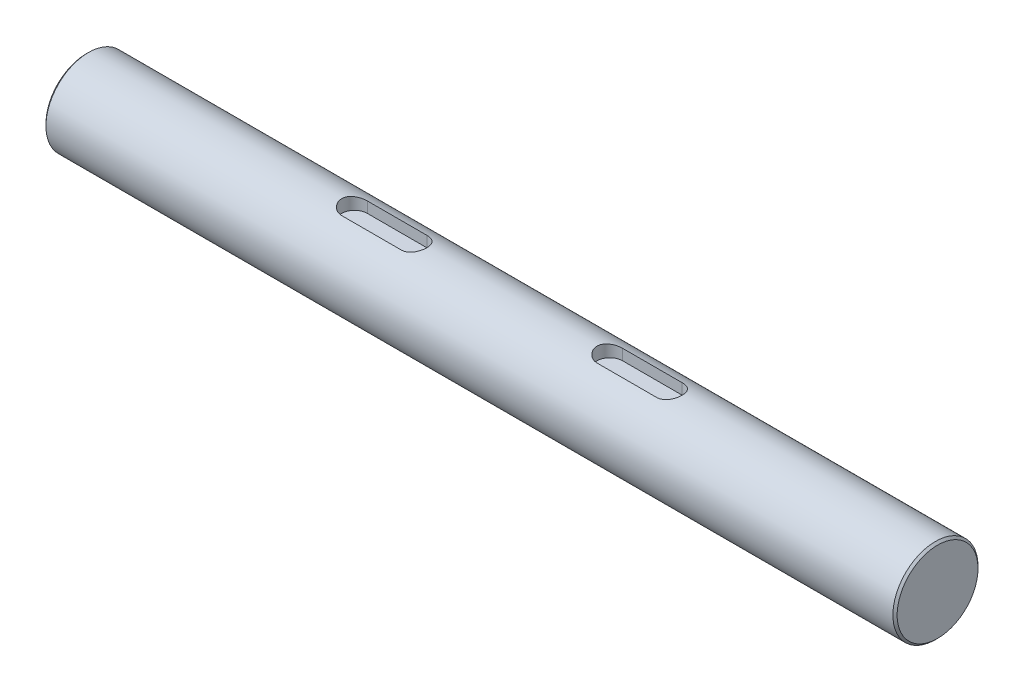
ISO-10303-21;
HEADER;
FILE_DESCRIPTION(('STEP AP214'),'2;1');
FILE_NAME('part.step','',(''),(''),'','','');
FILE_SCHEMA(('AUTOMOTIVE_DESIGN { 1 0 10303 214 1 1 1 1 }'));
ENDSEC;
DATA;
#1=APPLICATION_CONTEXT('core data for automotive mechanical design processes');
#2=APPLICATION_PROTOCOL_DEFINITION('international standard','automotive_design',2000,#1);
#3=PRODUCT_CONTEXT('',#1,'mechanical');
#4=PRODUCT('Part','Part','',(#3));
#5=PRODUCT_RELATED_PRODUCT_CATEGORY('part','',(#4));
#6=PRODUCT_DEFINITION_FORMATION('','',#4);
#7=PRODUCT_DEFINITION_CONTEXT('part definition',#1,'design');
#8=PRODUCT_DEFINITION('design','',#6,#7);
#9=PRODUCT_DEFINITION_SHAPE('','',#8);
#10=(LENGTH_UNIT() NAMED_UNIT(*) SI_UNIT(.MILLI.,.METRE.));
#11=(NAMED_UNIT(*) PLANE_ANGLE_UNIT() SI_UNIT($,.RADIAN.));
#12=(NAMED_UNIT(*) SI_UNIT($,.STERADIAN.) SOLID_ANGLE_UNIT());
#13=UNCERTAINTY_MEASURE_WITH_UNIT(LENGTH_MEASURE(1.E-05),#10,'distance_accuracy_value','');
#14=(GEOMETRIC_REPRESENTATION_CONTEXT(3) GLOBAL_UNCERTAINTY_ASSIGNED_CONTEXT((#13)) GLOBAL_UNIT_ASSIGNED_CONTEXT((#10,
#11,#12)) REPRESENTATION_CONTEXT('',''));
#15=CARTESIAN_POINT('',(0.,0.,0.));
#16=DIRECTION('',(0.,0.,1.));
#17=DIRECTION('',(1.,0.,0.));
#18=AXIS2_PLACEMENT_3D('',#15,#16,#17);
#19=CARTESIAN_POINT('',(100.,0.,0.));
#20=DIRECTION('',(-1.,0.,0.));
#21=DIRECTION('',(0.,0.,1.));
#22=AXIS2_PLACEMENT_3D('',#19,#20,#21);
#23=CYLINDRICAL_SURFACE('',#22,10.);
#24=CARTESIAN_POINT('',(199.5,0.,0.));
#25=DIRECTION('',(1.,0.,0.));
#26=DIRECTION('',(0.,0.,-1.));
#27=AXIS2_PLACEMENT_3D('',#24,#25,#26);
#28=CIRCLE('',#27,10.);
#29=CARTESIAN_POINT('',(199.5,0.,-10.));
#30=VERTEX_POINT('',#29);
#31=EDGE_CURVE('E11',#30,#30,#28,.F.);
#32=ORIENTED_EDGE('',*,*,#31,.T.);
#33=EDGE_LOOP('',(#32));
#34=FACE_BOUND('',#33,.T.);
#35=DIRECTION('',(-1.,0.,0.));
#36=VECTOR('',#35,1.);
#37=CARTESIAN_POINT('',(100.,9.53939201416946,-3.));
#38=LINE('',#37,#36);
#39=CARTESIAN_POINT('',(123.,9.53939201416946,-3.));
#40=VERTEX_POINT('',#39);
#41=CARTESIAN_POINT('',(137.,9.53939201416946,-3.));
#42=VERTEX_POINT('',#41);
#43=EDGE_CURVE('E385',#40,#42,#38,.F.);
#44=ORIENTED_EDGE('',*,*,#43,.T.);
#45=CARTESIAN_POINT('',(137.,9.53939201416946,-3.));
#46=CARTESIAN_POINT('',(137.082335520823,9.53938054248206,-3.00001027845728));
#47=CARTESIAN_POINT('',(137.164664455063,9.54045772064378,-2.99661062684472));
#48=CARTESIAN_POINT('',(137.328693952765,9.54470412105986,-2.98307142899347));
#49=CARTESIAN_POINT('',(137.410394653324,9.54787287296849,-2.97293339805419));
#50=CARTESIAN_POINT('',(137.572384915673,9.55620668351003,-2.94603140625046));
#51=CARTESIAN_POINT('',(137.652677524043,9.56136667250114,-2.92928426957738));
#52=CARTESIAN_POINT('',(137.811475844134,9.57351626651178,-2.88932853030395));
#53=CARTESIAN_POINT('',(137.889981509067,9.58050591937828,-2.86611975872641));
#54=CARTESIAN_POINT('',(138.12194938799,9.60391637654137,-2.78708584446024));
#55=CARTESIAN_POINT('',(138.272068438833,9.62279007830391,-2.72181852542972));
#56=CARTESIAN_POINT('',(138.559226043979,9.66493213967819,-2.56815043531276));
#57=CARTESIAN_POINT('',(138.696258470762,9.68820254290641,-2.4797388992416));
#58=CARTESIAN_POINT('',(138.957722987948,9.73733650515374,-2.27929879634443));
#59=CARTESIAN_POINT('',(139.081684874061,9.76325505469874,-2.16666914746584));
#60=CARTESIAN_POINT('',(139.309273614839,9.81429628475077,-1.92227736150434));
#61=CARTESIAN_POINT('',(139.412897033861,9.8394188301941,-1.79051199848164));
#62=CARTESIAN_POINT('',(139.598926865095,9.88666477976534,-1.50821997465698));
#63=CARTESIAN_POINT('',(139.680850179783,9.90871541546877,-1.35736167401016));
#64=CARTESIAN_POINT('',(139.817977004003,9.94668940088144,-1.04324233568303));
#65=CARTESIAN_POINT('',(139.873187403368,9.96261433032403,-0.879984508687989));
#66=CARTESIAN_POINT('',(139.953759551791,9.98615279768398,-0.550649404820608));
#67=CARTESIAN_POINT('',(139.979929703518,9.99399098526792,-0.384786253016209));
#68=CARTESIAN_POINT('',(140.004234695146,10.0012640407204,-0.0508471415689363));
#69=CARTESIAN_POINT('',(140.002374842678,10.0007004995012,0.117228393125328));
#70=CARTESIAN_POINT('',(139.971214179309,9.99139205125586,0.445143199271813));
#71=CARTESIAN_POINT('',(139.942789309192,9.98290831016512,0.605074290763019));
#72=CARTESIAN_POINT('',(139.860736730375,9.95903027401823,0.917780104370304));
#73=CARTESIAN_POINT('',(139.807107701317,9.94363561692558,1.07055445110878));
#74=CARTESIAN_POINT('',(139.675575556475,9.90730429851782,1.3666956317391));
#75=CARTESIAN_POINT('',(139.597396711224,9.88630511384915,1.50993201207611));
#76=CARTESIAN_POINT('',(139.419202819966,9.84099249303647,1.78153105916099));
#77=CARTESIAN_POINT('',(139.319182881059,9.81667831471806,1.90989038323249));
#78=CARTESIAN_POINT('',(139.095616023815,9.7662334714278,2.15330901082204));
#79=CARTESIAN_POINT('',(138.971312272474,9.74006890899097,2.26766702955975));
#80=CARTESIAN_POINT('',(138.705005153149,9.68968430229327,2.47413538985067));
#81=CARTESIAN_POINT('',(138.56299663927,9.66546482675134,2.5662392402618));
#82=CARTESIAN_POINT('',(138.2634381431,9.62154457591303,2.72632814481701));
#83=CARTESIAN_POINT('',(138.105745640813,9.60189192491895,2.79406012682262));
#84=CARTESIAN_POINT('',(137.780550992037,9.56991327306402,2.90171772009404));
#85=CARTESIAN_POINT('',(137.613064278571,9.55757606951749,2.94168586436072));
#86=CARTESIAN_POINT('',(137.37001022186,9.54628064650012,2.97802407180158));
#87=CARTESIAN_POINT('',(137.296218531641,9.54370312550533,2.98626405978017));
#88=CARTESIAN_POINT('',(137.148297041801,9.54025857223564,2.99724711229708));
#89=CARTESIAN_POINT('',(137.074167900672,9.53938902493288,2.99999825936538));
#90=CARTESIAN_POINT('',(137.,9.53939201416946,3.));
#91=B_SPLINE_CURVE_WITH_KNOTS('',3,(#45,#46,#47,#48,#49,#50,#51,#52,#53,#54,#55,#56,#57,#58,#59,
#60,#61,#62,#63,#64,#65,#66,#67,#68,#69,#70,#71,#72,#73,#74,#75,#76,#77,#78,#79,#80,#81,#82,#83,
#84,#85,#86,#87,#88,#89,#90),.UNSPECIFIED.,.F.,.F.,(4,2,2,2,2,2,2,2,2,2,2,2,2,2,2,2,2,2,2,2,2,2,
4),(0.,0.246918142439474,0.493780777706052,0.740019009622984,0.986263681482012,1.47813347402026,
1.97023245590778,2.47635119822767,2.98255536239032,3.4992281062007,4.01576751791672,
4.51753600864763,5.019209488041,5.50490358251092,5.9906231236083,6.4820058335062,
6.97349873739168,7.48389234847122,7.99443465298716,8.51013494368213,9.02504345105573,
9.24774267716778,9.47011372732391),.UNSPECIFIED.);
#92=CARTESIAN_POINT('',(137.,9.53939201416946,3.));
#93=VERTEX_POINT('',#92);
#94=EDGE_CURVE('E205',#42,#93,#91,.T.);
#95=ORIENTED_EDGE('',*,*,#94,.T.);
#96=DIRECTION('',(-1.,0.,0.));
#97=VECTOR('',#96,1.);
#98=CARTESIAN_POINT('',(100.,9.53939201416946,3.));
#99=LINE('',#98,#97);
#100=CARTESIAN_POINT('',(123.,9.53939201416946,3.));
#101=VERTEX_POINT('',#100);
#102=EDGE_CURVE('E387',#93,#101,#99,.T.);
#103=ORIENTED_EDGE('',*,*,#102,.T.);
#104=CARTESIAN_POINT('',(123.,9.53939201416946,3.));
#105=CARTESIAN_POINT('',(122.917664479177,9.53938054248207,3.00001027845728));
#106=CARTESIAN_POINT('',(122.835335544937,9.54045772064378,2.99661062684472));
#107=CARTESIAN_POINT('',(122.671306047235,9.54470412105986,2.98307142899347));
#108=CARTESIAN_POINT('',(122.589605346676,9.54787287296849,2.97293339805418));
#109=CARTESIAN_POINT('',(122.427615084327,9.55620668351003,2.94603140625045));
#110=CARTESIAN_POINT('',(122.347322475957,9.56136667250114,2.92928426957737));
#111=CARTESIAN_POINT('',(122.188524155866,9.57351626651178,2.88932853030394));
#112=CARTESIAN_POINT('',(122.110018490933,9.58050591937828,2.8661197587264));
#113=CARTESIAN_POINT('',(121.87805061201,9.60391637654137,2.78708584446024));
#114=CARTESIAN_POINT('',(121.727931561167,9.62279007830391,2.72181852542972));
#115=CARTESIAN_POINT('',(121.440773956021,9.66493213967819,2.56815043531276));
#116=CARTESIAN_POINT('',(121.303741529238,9.68820254290641,2.4797388992416));
#117=CARTESIAN_POINT('',(121.042277012052,9.73733650515374,2.27929879634443));
#118=CARTESIAN_POINT('',(120.918315125939,9.76325505469874,2.16666914746584));
#119=CARTESIAN_POINT('',(120.690726385161,9.81429628475077,1.92227736150433));
#120=CARTESIAN_POINT('',(120.587102966139,9.8394188301941,1.79051199848164));
#121=CARTESIAN_POINT('',(120.401073134905,9.88666477976534,1.50821997465697));
#122=CARTESIAN_POINT('',(120.319149820217,9.90871541546878,1.35736167401015));
#123=CARTESIAN_POINT('',(120.182022995997,9.94668940088144,1.04324233568302));
#124=CARTESIAN_POINT('',(120.126812596632,9.96261433032403,0.879984508687983));
#125=CARTESIAN_POINT('',(120.046240448209,9.98615279768398,0.550649404820599));
#126=CARTESIAN_POINT('',(120.020070296482,9.99399098526792,0.384786253016201));
#127=CARTESIAN_POINT('',(119.995765304854,10.0012640407204,0.0508471415689247));
#128=CARTESIAN_POINT('',(119.997625157322,10.0007004995012,-0.117228393125343));
#129=CARTESIAN_POINT('',(120.028785820691,9.99139205125586,-0.445143199271829));
#130=CARTESIAN_POINT('',(120.057210690808,9.98290831016512,-0.605074290763033));
#131=CARTESIAN_POINT('',(120.139263269626,9.95903027401822,-0.917780104370318));
#132=CARTESIAN_POINT('',(120.192892298683,9.94363561692558,-1.07055445110879));
#133=CARTESIAN_POINT('',(120.324424443525,9.90730429851782,-1.36669563173912));
#134=CARTESIAN_POINT('',(120.402603288776,9.88630511384915,-1.50993201207613));
#135=CARTESIAN_POINT('',(120.580797180034,9.84099249303646,-1.78153105916101));
#136=CARTESIAN_POINT('',(120.680817118941,9.81667831471806,-1.90989038323251));
#137=CARTESIAN_POINT('',(120.904383976185,9.7662334714278,-2.15330901082205));
#138=CARTESIAN_POINT('',(121.028687727526,9.74006890899097,-2.26766702955975));
#139=CARTESIAN_POINT('',(121.294994846851,9.68968430229327,-2.47413538985067));
#140=CARTESIAN_POINT('',(121.43700336073,9.66546482675134,-2.5662392402618));
#141=CARTESIAN_POINT('',(121.7365618569,9.62154457591303,-2.72632814481701));
#142=CARTESIAN_POINT('',(121.894254359187,9.60189192491895,-2.79406012682263));
#143=CARTESIAN_POINT('',(122.219449007963,9.56991327306402,-2.90171772009405));
#144=CARTESIAN_POINT('',(122.386935721429,9.55757606951749,-2.94168586436072));
#145=CARTESIAN_POINT('',(122.62998977814,9.54628064650012,-2.97802407180159));
#146=CARTESIAN_POINT('',(122.703781468359,9.54370312550533,-2.98626405978017));
#147=CARTESIAN_POINT('',(122.851702958199,9.54025857223564,-2.99724711229708));
#148=CARTESIAN_POINT('',(122.925832099328,9.53938902493288,-2.99999825936538));
#149=CARTESIAN_POINT('',(123.,9.53939201416946,-3.));
#150=B_SPLINE_CURVE_WITH_KNOTS('',3,(#104,#105,#106,#107,#108,#109,#110,#111,#112,#113,#114,
#115,#116,#117,#118,#119,#120,#121,#122,#123,#124,#125,#126,#127,#128,#129,#130,#131,#132,#133,
#134,#135,#136,#137,#138,#139,#140,#141,#142,#143,#144,#145,#146,#147,#148,#149),.UNSPECIFIED.,
.F.,.F.,(4,2,2,2,2,2,2,2,2,2,2,2,2,2,2,2,2,2,2,2,2,2,4),(0.,0.246918142439488,0.493780777706108,
0.740019009623027,0.986263681482027,1.47813347402025,1.97023245590778,2.47635119822765,
2.98255536239033,3.49922810620071,4.01576751791672,4.51753600864764,5.01920948804101,
5.50490358251093,5.99062312360832,6.48200583350622,6.9734987373917,7.48389234847122,
7.99443465298715,8.51013494368214,9.02504345105574,9.24774267716778,9.47011372732391),.UNSPECIFIED.);
#151=EDGE_CURVE('E58',#101,#40,#150,.T.);
#152=ORIENTED_EDGE('',*,*,#151,.T.);
#153=EDGE_LOOP('',(#44,#95,#103,#152));
#154=FACE_BOUND('',#153,.T.);
#155=CARTESIAN_POINT('',(0.499999999999987,0.,0.));
#156=DIRECTION('',(1.,0.,0.));
#157=DIRECTION('',(0.,0.,-1.));
#158=AXIS2_PLACEMENT_3D('',#155,#156,#157);
#159=CIRCLE('',#158,10.);
#160=CARTESIAN_POINT('',(0.499999999999987,0.,-10.));
#161=VERTEX_POINT('',#160);
#162=EDGE_CURVE('E206',#161,#161,#159,.T.);
#163=ORIENTED_EDGE('',*,*,#162,.T.);
#164=EDGE_LOOP('',(#163));
#165=FACE_BOUND('',#164,.T.);
#166=DIRECTION('',(-1.,0.,0.));
#167=VECTOR('',#166,1.);
#168=CARTESIAN_POINT('',(100.,9.53939201416946,-3.));
#169=LINE('',#168,#167);
#170=CARTESIAN_POINT('',(63.,9.53939201416946,-3.));
#171=VERTEX_POINT('',#170);
#172=CARTESIAN_POINT('',(77.,9.53939201416946,-3.));
#173=VERTEX_POINT('',#172);
#174=EDGE_CURVE('E211',#171,#173,#169,.F.);
#175=ORIENTED_EDGE('',*,*,#174,.T.);
#176=CARTESIAN_POINT('',(77.,9.53939201416946,-3.));
#177=CARTESIAN_POINT('',(77.0823355208227,9.53938054248207,-3.00001027845728));
#178=CARTESIAN_POINT('',(77.1646644550632,9.54045772064378,-2.99661062684472));
#179=CARTESIAN_POINT('',(77.3286939527655,9.54470412105986,-2.98307142899347));
#180=CARTESIAN_POINT('',(77.4103946533244,9.54787287296849,-2.97293339805418));
#181=CARTESIAN_POINT('',(77.5723849156732,9.55620668351003,-2.94603140625045));
#182=CARTESIAN_POINT('',(77.652677524043,9.56136667250114,-2.92928426957737));
#183=CARTESIAN_POINT('',(77.8114758441342,9.57351626651178,-2.88932853030394));
#184=CARTESIAN_POINT('',(77.8899815090674,9.58050591937828,-2.8661197587264));
#185=CARTESIAN_POINT('',(78.1219493879902,9.60391637654137,-2.78708584446024));
#186=CARTESIAN_POINT('',(78.272068438833,9.62279007830391,-2.72181852542972));
#187=CARTESIAN_POINT('',(78.559226043979,9.66493213967819,-2.56815043531276));
#188=CARTESIAN_POINT('',(78.6962584707622,9.68820254290641,-2.4797388992416));
#189=CARTESIAN_POINT('',(78.9577229879478,9.73733650515374,-2.27929879634443));
#190=CARTESIAN_POINT('',(79.0816848740609,9.76325505469874,-2.16666914746584));
#191=CARTESIAN_POINT('',(79.3092736148387,9.81429628475077,-1.92227736150433));
#192=CARTESIAN_POINT('',(79.412897033861,9.8394188301941,-1.79051199848164));
#193=CARTESIAN_POINT('',(79.5989268650946,9.88666477976534,-1.50821997465697));
#194=CARTESIAN_POINT('',(79.6808501797826,9.90871541546877,-1.35736167401016));
#195=CARTESIAN_POINT('',(79.8179770040029,9.94668940088144,-1.04324233568303));
#196=CARTESIAN_POINT('',(79.873187403368,9.96261433032403,-0.879984508687985));
#197=CARTESIAN_POINT('',(79.953759551791,9.98615279768398,-0.550649404820601));
#198=CARTESIAN_POINT('',(79.9799297035176,9.99399098526792,-0.384786253016201));
#199=CARTESIAN_POINT('',(80.004234695146,10.0012640407204,-0.0508471415689243));
#200=CARTESIAN_POINT('',(80.0023748426782,10.0007004995012,0.117228393125343));
#201=CARTESIAN_POINT('',(79.9712141793085,9.99139205125586,0.445143199271829));
#202=CARTESIAN_POINT('',(79.9427893091919,9.98290831016512,0.605074290763033));
#203=CARTESIAN_POINT('',(79.8607367303745,9.95903027401822,0.917780104370318));
#204=CARTESIAN_POINT('',(79.8071077013173,9.94363561692558,1.07055445110879));
#205=CARTESIAN_POINT('',(79.6755755564753,9.90730429851782,1.36669563173912));
#206=CARTESIAN_POINT('',(79.5973967112239,9.88630511384915,1.50993201207613));
#207=CARTESIAN_POINT('',(79.4192028199656,9.84099249303646,1.78153105916101));
#208=CARTESIAN_POINT('',(79.3191828810593,9.81667831471806,1.90989038323251));
#209=CARTESIAN_POINT('',(79.0956160238154,9.7662334714278,2.15330901082205));
#210=CARTESIAN_POINT('',(78.9713122724738,9.74006890899097,2.26766702955975));
#211=CARTESIAN_POINT('',(78.7050051531489,9.68968430229327,2.47413538985067));
#212=CARTESIAN_POINT('',(78.5629966392702,9.66546482675134,2.5662392402618));
#213=CARTESIAN_POINT('',(78.2634381431001,9.62154457591303,2.72632814481701));
#214=CARTESIAN_POINT('',(78.1057456408129,9.60189192491895,2.79406012682263));
#215=CARTESIAN_POINT('',(77.7805509920369,9.56991327306402,2.90171772009405));
#216=CARTESIAN_POINT('',(77.6130642785713,9.55757606951749,2.94168586436072));
#217=CARTESIAN_POINT('',(77.3700102218596,9.54628064650012,2.97802407180159));
#218=CARTESIAN_POINT('',(77.2962185316408,9.54370312550533,2.98626405978017));
#219=CARTESIAN_POINT('',(77.148297041801,9.54025857223564,2.99724711229708));
#220=CARTESIAN_POINT('',(77.0741679006723,9.53938902493288,2.99999825936538));
#221=CARTESIAN_POINT('',(77.,9.53939201416946,3.));
#222=B_SPLINE_CURVE_WITH_KNOTS('',3,(#176,#177,#178,#179,#180,#181,#182,#183,#184,#185,#186,
#187,#188,#189,#190,#191,#192,#193,#194,#195,#196,#197,#198,#199,#200,#201,#202,#203,#204,#205,
#206,#207,#208,#209,#210,#211,#212,#213,#214,#215,#216,#217,#218,#219,#220,#221),.UNSPECIFIED.,
.F.,.F.,(4,2,2,2,2,2,2,2,2,2,2,2,2,2,2,2,2,2,2,2,2,2,4),(0.,0.246918142439488,0.493780777706108,
0.740019009623027,0.986263681482027,1.47813347402025,1.97023245590778,2.47635119822765,
2.98255536239033,3.4992281062007,4.01576751791672,4.51753600864764,5.01920948804101,
5.50490358251093,5.99062312360832,6.48200583350621,6.9734987373917,7.48389234847122,
7.99443465298715,8.51013494368214,9.02504345105574,9.24774267716777,9.47011372732391),.UNSPECIFIED.);
#223=CARTESIAN_POINT('',(77.,9.53939201416946,3.));
#224=VERTEX_POINT('',#223);
#225=EDGE_CURVE('E155',#173,#224,#222,.T.);
#226=ORIENTED_EDGE('',*,*,#225,.T.);
#227=DIRECTION('',(-1.,0.,0.));
#228=VECTOR('',#227,1.);
#229=CARTESIAN_POINT('',(100.,9.53939201416946,3.));
#230=LINE('',#229,#228);
#231=CARTESIAN_POINT('',(63.,9.53939201416946,3.));
#232=VERTEX_POINT('',#231);
#233=EDGE_CURVE('E252',#224,#232,#230,.T.);
#234=ORIENTED_EDGE('',*,*,#233,.T.);
#235=CARTESIAN_POINT('',(63.,9.53939201416946,3.));
#236=CARTESIAN_POINT('',(62.9176644791773,9.53938054248207,3.00001027845728));
#237=CARTESIAN_POINT('',(62.8353355449368,9.54045772064378,2.99661062684472));
#238=CARTESIAN_POINT('',(62.6713060472345,9.54470412105986,2.98307142899347));
#239=CARTESIAN_POINT('',(62.5896053466756,9.54787287296848,2.97293339805418));
#240=CARTESIAN_POINT('',(62.4276150843268,9.55620668351003,2.94603140625045));
#241=CARTESIAN_POINT('',(62.347322475957,9.56136667250114,2.92928426957737));
#242=CARTESIAN_POINT('',(62.1885241558658,9.57351626651178,2.88932853030394));
#243=CARTESIAN_POINT('',(62.1100184909326,9.58050591937828,2.8661197587264));
#244=CARTESIAN_POINT('',(61.8780506120099,9.60391637654137,2.78708584446024));
#245=CARTESIAN_POINT('',(61.727931561167,9.62279007830391,2.72181852542972));
#246=CARTESIAN_POINT('',(61.440773956021,9.66493213967819,2.56815043531276));
#247=CARTESIAN_POINT('',(61.3037415292378,9.68820254290641,2.47973889924159));
#248=CARTESIAN_POINT('',(61.0422770120522,9.73733650515374,2.27929879634442));
#249=CARTESIAN_POINT('',(60.9183151259391,9.76325505469874,2.16666914746584));
#250=CARTESIAN_POINT('',(60.6907263851612,9.81429628475077,1.92227736150433));
#251=CARTESIAN_POINT('',(60.587102966139,9.8394188301941,1.79051199848164));
#252=CARTESIAN_POINT('',(60.4010731349054,9.88666477976534,1.50821997465697));
#253=CARTESIAN_POINT('',(60.3191498202174,9.90871541546877,1.35736167401016));
#254=CARTESIAN_POINT('',(60.1820229959971,9.94668940088144,1.04324233568303));
#255=CARTESIAN_POINT('',(60.126812596632,9.96261433032403,0.879984508687984));
#256=CARTESIAN_POINT('',(60.046240448209,9.98615279768398,0.550649404820599));
#257=CARTESIAN_POINT('',(60.0200702964824,9.99399098526792,0.384786253016202));
#258=CARTESIAN_POINT('',(59.995765304854,10.0012640407204,0.0508471415689267));
#259=CARTESIAN_POINT('',(59.9976251573218,10.0007004995012,-0.11722839312534));
#260=CARTESIAN_POINT('',(60.0287858206914,9.99139205125586,-0.445143199271826));
#261=CARTESIAN_POINT('',(60.0572106908081,9.98290831016512,-0.605074290763029));
#262=CARTESIAN_POINT('',(60.1392632696255,9.95903027401822,-0.917780104370316));
#263=CARTESIAN_POINT('',(60.1928922986827,9.94363561692558,-1.07055445110879));
#264=CARTESIAN_POINT('',(60.3244244435248,9.90730429851782,-1.36669563173912));
#265=CARTESIAN_POINT('',(60.4026032887761,9.88630511384915,-1.50993201207613));
#266=CARTESIAN_POINT('',(60.5807971800344,9.84099249303646,-1.781531059161));
#267=CARTESIAN_POINT('',(60.6808171189407,9.81667831471806,-1.90989038323251));
#268=CARTESIAN_POINT('',(60.9043839761846,9.7662334714278,-2.15330901082206));
#269=CARTESIAN_POINT('',(61.0286877275262,9.74006890899097,-2.26766702955976));
#270=CARTESIAN_POINT('',(61.2949948468511,9.68968430229327,-2.47413538985067));
#271=CARTESIAN_POINT('',(61.4370033607298,9.66546482675133,-2.5662392402618));
#272=CARTESIAN_POINT('',(61.7365618568999,9.62154457591303,-2.72632814481701));
#273=CARTESIAN_POINT('',(61.8942543591871,9.60189192491896,-2.79406012682262));
#274=CARTESIAN_POINT('',(62.2194490079631,9.56991327306402,-2.90171772009404));
#275=CARTESIAN_POINT('',(62.3869357214287,9.55757606951749,-2.94168586436072));
#276=CARTESIAN_POINT('',(62.6299897781404,9.54628064650011,-2.97802407180159));
#277=CARTESIAN_POINT('',(62.7037814683592,9.54370312550533,-2.98626405978017));
#278=CARTESIAN_POINT('',(62.851702958199,9.54025857223564,-2.99724711229708));
#279=CARTESIAN_POINT('',(62.9258320993277,9.53938902493288,-2.99999825936538));
#280=CARTESIAN_POINT('',(63.,9.53939201416946,-3.));
#281=B_SPLINE_CURVE_WITH_KNOTS('',3,(#235,#236,#237,#238,#239,#240,#241,#242,#243,#244,#245,
#246,#247,#248,#249,#250,#251,#252,#253,#254,#255,#256,#257,#258,#259,#260,#261,#262,#263,#264,
#265,#266,#267,#268,#269,#270,#271,#272,#273,#274,#275,#276,#277,#278,#279,#280),.UNSPECIFIED.,
.F.,.F.,(4,2,2,2,2,2,2,2,2,2,2,2,2,2,2,2,2,2,2,2,2,2,4),(0.,0.246918142439488,0.493780777706094,
0.740019009623013,0.986263681482027,1.47813347402026,1.97023245590779,2.47635119822766,
2.98255536239032,3.4992281062007,4.01576751791672,4.51753600864764,5.01920948804101,
5.50490358251093,5.99062312360831,6.48200583350621,6.9734987373917,7.48389234847122,
7.99443465298715,8.51013494368213,9.02504345105573,9.24774267716777,9.47011372732391),.UNSPECIFIED.);
#282=EDGE_CURVE('E66',#232,#171,#281,.T.);
#283=ORIENTED_EDGE('',*,*,#282,.T.);
#284=EDGE_LOOP('',(#175,#226,#234,#283));
#285=FACE_BOUND('',#284,.T.);
#286=ADVANCED_FACE('F42',(#34,#154,#165,#285),#23,.T.);
#287=CARTESIAN_POINT('',(0.,0.,0.));
#288=DIRECTION('',(1.,0.,0.));
#289=DIRECTION('',(0.,0.,-1.));
#290=AXIS2_PLACEMENT_3D('',#287,#288,#289);
#291=PLANE('',#290);
#292=CARTESIAN_POINT('',(0.,0.,0.));
#293=DIRECTION('',(1.,0.,0.));
#294=DIRECTION('',(0.,0.,-1.));
#295=AXIS2_PLACEMENT_3D('',#292,#293,#294);
#296=CIRCLE('',#295,9.50000000000001);
#297=CARTESIAN_POINT('',(0.,0.,-9.50000000000001));
#298=VERTEX_POINT('',#297);
#299=EDGE_CURVE('E203',#298,#298,#296,.F.);
#300=ORIENTED_EDGE('',*,*,#299,.T.);
#301=EDGE_LOOP('',(#300));
#302=FACE_BOUND('',#301,.T.);
#303=ADVANCED_FACE('F194',(#302),#291,.F.);
#304=CARTESIAN_POINT('',(63.,7.,0.));
#305=DIRECTION('',(0.,1.,0.));
#306=DIRECTION('',(0.,0.,1.));
#307=AXIS2_PLACEMENT_3D('',#304,#305,#306);
#308=CYLINDRICAL_SURFACE('',#307,3.);
#309=DIRECTION('',(0.,1.,0.));
#310=VECTOR('',#309,1.);
#311=CARTESIAN_POINT('',(63.,7.,3.));
#312=LINE('',#311,#310);
#313=CARTESIAN_POINT('',(63.,7.,3.));
#314=VERTEX_POINT('',#313);
#315=EDGE_CURVE('E152',#314,#232,#312,.T.);
#316=ORIENTED_EDGE('',*,*,#315,.F.);
#317=CARTESIAN_POINT('',(63.,7.,0.));
#318=DIRECTION('',(0.,1.,0.));
#319=DIRECTION('',(0.,0.,1.));
#320=AXIS2_PLACEMENT_3D('',#317,#318,#319);
#321=CIRCLE('',#320,3.);
#322=CARTESIAN_POINT('',(63.,7.,-3.));
#323=VERTEX_POINT('',#322);
#324=EDGE_CURVE('E136',#323,#314,#321,.T.);
#325=ORIENTED_EDGE('',*,*,#324,.F.);
#326=DIRECTION('',(0.,1.,0.));
#327=VECTOR('',#326,1.);
#328=CARTESIAN_POINT('',(63.,7.,-3.));
#329=LINE('',#328,#327);
#330=EDGE_CURVE('E153',#323,#171,#329,.T.);
#331=ORIENTED_EDGE('',*,*,#330,.T.);
#332=ORIENTED_EDGE('',*,*,#282,.F.);
#333=EDGE_LOOP('',(#316,#325,#331,#332));
#334=FACE_BOUND('',#333,.T.);
#335=ADVANCED_FACE('F191',(#334),#308,.F.);
#336=CARTESIAN_POINT('',(63.,7.,-3.));
#337=DIRECTION('',(0.,0.,-1.));
#338=DIRECTION('',(-1.,0.,0.));
#339=AXIS2_PLACEMENT_3D('',#336,#337,#338);
#340=PLANE('',#339);
#341=ORIENTED_EDGE('',*,*,#330,.F.);
#342=DIRECTION('',(-1.,0.,0.));
#343=VECTOR('',#342,1.);
#344=CARTESIAN_POINT('',(63.,7.,-3.));
#345=LINE('',#344,#343);
#346=CARTESIAN_POINT('',(77.,7.,-3.));
#347=VERTEX_POINT('',#346);
#348=EDGE_CURVE('E149',#347,#323,#345,.T.);
#349=ORIENTED_EDGE('',*,*,#348,.F.);
#350=DIRECTION('',(0.,1.,0.));
#351=VECTOR('',#350,1.);
#352=CARTESIAN_POINT('',(77.,7.,-3.));
#353=LINE('',#352,#351);
#354=EDGE_CURVE('E156',#347,#173,#353,.T.);
#355=ORIENTED_EDGE('',*,*,#354,.T.);
#356=ORIENTED_EDGE('',*,*,#174,.F.);
#357=EDGE_LOOP('',(#341,#349,#355,#356));
#358=FACE_BOUND('',#357,.T.);
#359=ADVANCED_FACE('F185',(#358),#340,.F.);
#360=CARTESIAN_POINT('',(77.,7.,0.));
#361=DIRECTION('',(0.,1.,0.));
#362=DIRECTION('',(0.,0.,1.));
#363=AXIS2_PLACEMENT_3D('',#360,#361,#362);
#364=CYLINDRICAL_SURFACE('',#363,3.);
#365=ORIENTED_EDGE('',*,*,#354,.F.);
#366=CARTESIAN_POINT('',(77.,7.,0.));
#367=DIRECTION('',(0.,1.,0.));
#368=DIRECTION('',(0.,0.,-1.));
#369=AXIS2_PLACEMENT_3D('',#366,#367,#368);
#370=CIRCLE('',#369,3.);
#371=CARTESIAN_POINT('',(77.,7.,3.));
#372=VERTEX_POINT('',#371);
#373=EDGE_CURVE('E146',#372,#347,#370,.T.);
#374=ORIENTED_EDGE('',*,*,#373,.F.);
#375=DIRECTION('',(0.,1.,0.));
#376=VECTOR('',#375,1.);
#377=CARTESIAN_POINT('',(77.,7.,3.));
#378=LINE('',#377,#376);
#379=EDGE_CURVE('E159',#372,#224,#378,.T.);
#380=ORIENTED_EDGE('',*,*,#379,.T.);
#381=ORIENTED_EDGE('',*,*,#225,.F.);
#382=EDGE_LOOP('',(#365,#374,#380,#381));
#383=FACE_BOUND('',#382,.T.);
#384=ADVANCED_FACE('F179',(#383),#364,.F.);
#385=CARTESIAN_POINT('',(63.,7.,3.));
#386=DIRECTION('',(0.,0.,1.));
#387=DIRECTION('',(1.,0.,0.));
#388=AXIS2_PLACEMENT_3D('',#385,#386,#387);
#389=PLANE('',#388);
#390=ORIENTED_EDGE('',*,*,#379,.F.);
#391=DIRECTION('',(1.,0.,0.));
#392=VECTOR('',#391,1.);
#393=CARTESIAN_POINT('',(63.,7.,3.));
#394=LINE('',#393,#392);
#395=EDGE_CURVE('E143',#314,#372,#394,.T.);
#396=ORIENTED_EDGE('',*,*,#395,.F.);
#397=ORIENTED_EDGE('',*,*,#315,.T.);
#398=ORIENTED_EDGE('',*,*,#233,.F.);
#399=EDGE_LOOP('',(#390,#396,#397,#398));
#400=FACE_BOUND('',#399,.T.);
#401=ADVANCED_FACE('F184',(#400),#389,.F.);
#402=CARTESIAN_POINT('',(63.,7.,0.));
#403=DIRECTION('',(0.,1.,0.));
#404=DIRECTION('',(0.,0.,1.));
#405=AXIS2_PLACEMENT_3D('',#402,#403,#404);
#406=PLANE('',#405);
#407=ORIENTED_EDGE('',*,*,#324,.T.);
#408=ORIENTED_EDGE('',*,*,#395,.T.);
#409=ORIENTED_EDGE('',*,*,#373,.T.);
#410=ORIENTED_EDGE('',*,*,#348,.T.);
#411=EDGE_LOOP('',(#407,#408,#409,#410));
#412=FACE_BOUND('',#411,.T.);
#413=ADVANCED_FACE('F189',(#412),#406,.T.);
#414=CARTESIAN_POINT('',(0.499999999999987,0.,0.));
#415=DIRECTION('',(1.,0.,0.));
#416=DIRECTION('',(0.,0.,-1.));
#417=AXIS2_PLACEMENT_3D('',#414,#415,#416);
#418=CONICAL_SURFACE('',#417,10.,0.785398163397454);
#419=ORIENTED_EDGE('',*,*,#299,.F.);
#420=EDGE_LOOP('',(#419));
#421=FACE_BOUND('',#420,.T.);
#422=ORIENTED_EDGE('',*,*,#162,.F.);
#423=EDGE_LOOP('',(#422));
#424=FACE_BOUND('',#423,.T.);
#425=ADVANCED_FACE('F240',(#421,#424),#418,.T.);
#426=CARTESIAN_POINT('',(200.,0.,0.));
#427=DIRECTION('',(1.,0.,0.));
#428=DIRECTION('',(0.,0.,-1.));
#429=AXIS2_PLACEMENT_3D('',#426,#427,#428);
#430=PLANE('',#429);
#431=CARTESIAN_POINT('',(200.,0.,0.));
#432=DIRECTION('',(1.,0.,0.));
#433=DIRECTION('',(0.,0.,-1.));
#434=AXIS2_PLACEMENT_3D('',#431,#432,#433);
#435=CIRCLE('',#434,9.50000000000001);
#436=CARTESIAN_POINT('',(200.,0.,-9.50000000000001));
#437=VERTEX_POINT('',#436);
#438=EDGE_CURVE('E51',#437,#437,#435,.T.);
#439=ORIENTED_EDGE('',*,*,#438,.T.);
#440=EDGE_LOOP('',(#439));
#441=FACE_BOUND('',#440,.T.);
#442=ADVANCED_FACE('F238',(#441),#430,.T.);
#443=CARTESIAN_POINT('',(123.,7.,0.));
#444=DIRECTION('',(0.,1.,0.));
#445=DIRECTION('',(0.,0.,1.));
#446=AXIS2_PLACEMENT_3D('',#443,#444,#445);
#447=CYLINDRICAL_SURFACE('',#446,3.);
#448=DIRECTION('',(0.,1.,0.));
#449=VECTOR('',#448,1.);
#450=CARTESIAN_POINT('',(123.,7.,3.));
#451=LINE('',#450,#449);
#452=CARTESIAN_POINT('',(123.,7.,3.));
#453=VERTEX_POINT('',#452);
#454=EDGE_CURVE('E108',#453,#101,#451,.T.);
#455=ORIENTED_EDGE('',*,*,#454,.F.);
#456=CARTESIAN_POINT('',(123.,7.,0.));
#457=DIRECTION('',(0.,1.,0.));
#458=DIRECTION('',(0.,0.,1.));
#459=AXIS2_PLACEMENT_3D('',#456,#457,#458);
#460=CIRCLE('',#459,3.);
#461=CARTESIAN_POINT('',(123.,7.,-3.));
#462=VERTEX_POINT('',#461);
#463=EDGE_CURVE('E112',#462,#453,#460,.T.);
#464=ORIENTED_EDGE('',*,*,#463,.F.);
#465=DIRECTION('',(0.,1.,0.));
#466=VECTOR('',#465,1.);
#467=CARTESIAN_POINT('',(123.,7.,-3.));
#468=LINE('',#467,#466);
#469=EDGE_CURVE('E134',#462,#40,#468,.T.);
#470=ORIENTED_EDGE('',*,*,#469,.T.);
#471=ORIENTED_EDGE('',*,*,#151,.F.);
#472=EDGE_LOOP('',(#455,#464,#470,#471));
#473=FACE_BOUND('',#472,.T.);
#474=ADVANCED_FACE('F110',(#473),#447,.F.);
#475=CARTESIAN_POINT('',(123.,7.,-3.));
#476=DIRECTION('',(0.,0.,-1.));
#477=DIRECTION('',(-1.,0.,0.));
#478=AXIS2_PLACEMENT_3D('',#475,#476,#477);
#479=PLANE('',#478);
#480=ORIENTED_EDGE('',*,*,#469,.F.);
#481=DIRECTION('',(-1.,0.,0.));
#482=VECTOR('',#481,1.);
#483=CARTESIAN_POINT('',(123.,7.,-3.));
#484=LINE('',#483,#482);
#485=CARTESIAN_POINT('',(137.,7.,-3.));
#486=VERTEX_POINT('',#485);
#487=EDGE_CURVE('E117',#486,#462,#484,.T.);
#488=ORIENTED_EDGE('',*,*,#487,.F.);
#489=DIRECTION('',(0.,1.,0.));
#490=VECTOR('',#489,1.);
#491=CARTESIAN_POINT('',(137.,7.,-3.));
#492=LINE('',#491,#490);
#493=EDGE_CURVE('E137',#486,#42,#492,.T.);
#494=ORIENTED_EDGE('',*,*,#493,.T.);
#495=ORIENTED_EDGE('',*,*,#43,.F.);
#496=EDGE_LOOP('',(#480,#488,#494,#495));
#497=FACE_BOUND('',#496,.T.);
#498=ADVANCED_FACE('F231',(#497),#479,.F.);
#499=CARTESIAN_POINT('',(137.,7.,0.));
#500=DIRECTION('',(0.,1.,0.));
#501=DIRECTION('',(0.,0.,1.));
#502=AXIS2_PLACEMENT_3D('',#499,#500,#501);
#503=CYLINDRICAL_SURFACE('',#502,3.);
#504=ORIENTED_EDGE('',*,*,#493,.F.);
#505=CARTESIAN_POINT('',(137.,7.,0.));
#506=DIRECTION('',(0.,1.,0.));
#507=DIRECTION('',(0.,0.,-1.));
#508=AXIS2_PLACEMENT_3D('',#505,#506,#507);
#509=CIRCLE('',#508,3.);
#510=CARTESIAN_POINT('',(137.,7.,3.));
#511=VERTEX_POINT('',#510);
#512=EDGE_CURVE('E126',#511,#486,#509,.T.);
#513=ORIENTED_EDGE('',*,*,#512,.F.);
#514=DIRECTION('',(0.,1.,0.));
#515=VECTOR('',#514,1.);
#516=CARTESIAN_POINT('',(137.,7.,3.));
#517=LINE('',#516,#515);
#518=EDGE_CURVE('E116',#511,#93,#517,.T.);
#519=ORIENTED_EDGE('',*,*,#518,.T.);
#520=ORIENTED_EDGE('',*,*,#94,.F.);
#521=EDGE_LOOP('',(#504,#513,#519,#520));
#522=FACE_BOUND('',#521,.T.);
#523=ADVANCED_FACE('F226',(#522),#503,.F.);
#524=CARTESIAN_POINT('',(123.,7.,3.));
#525=DIRECTION('',(0.,0.,1.));
#526=DIRECTION('',(1.,0.,0.));
#527=AXIS2_PLACEMENT_3D('',#524,#525,#526);
#528=PLANE('',#527);
#529=ORIENTED_EDGE('',*,*,#518,.F.);
#530=DIRECTION('',(1.,0.,0.));
#531=VECTOR('',#530,1.);
#532=CARTESIAN_POINT('',(123.,7.,3.));
#533=LINE('',#532,#531);
#534=EDGE_CURVE('E120',#453,#511,#533,.T.);
#535=ORIENTED_EDGE('',*,*,#534,.F.);
#536=ORIENTED_EDGE('',*,*,#454,.T.);
#537=ORIENTED_EDGE('',*,*,#102,.F.);
#538=EDGE_LOOP('',(#529,#535,#536,#537));
#539=FACE_BOUND('',#538,.T.);
#540=ADVANCED_FACE('F121',(#539),#528,.F.);
#541=CARTESIAN_POINT('',(123.,7.,0.));
#542=DIRECTION('',(0.,1.,0.));
#543=DIRECTION('',(0.,0.,1.));
#544=AXIS2_PLACEMENT_3D('',#541,#542,#543);
#545=PLANE('',#544);
#546=ORIENTED_EDGE('',*,*,#463,.T.);
#547=ORIENTED_EDGE('',*,*,#534,.T.);
#548=ORIENTED_EDGE('',*,*,#512,.T.);
#549=ORIENTED_EDGE('',*,*,#487,.T.);
#550=EDGE_LOOP('',(#546,#547,#548,#549));
#551=FACE_BOUND('',#550,.T.);
#552=ADVANCED_FACE('F128',(#551),#545,.T.);
#553=CARTESIAN_POINT('',(200.,0.,0.));
#554=DIRECTION('',(-1.,0.,0.));
#555=DIRECTION('',(0.,0.,1.));
#556=AXIS2_PLACEMENT_3D('',#553,#554,#555);
#557=CONICAL_SURFACE('',#556,9.50000000000001,0.78539816339744);
#558=ORIENTED_EDGE('',*,*,#31,.F.);
#559=EDGE_LOOP('',(#558));
#560=FACE_BOUND('',#559,.T.);
#561=ORIENTED_EDGE('',*,*,#438,.F.);
#562=EDGE_LOOP('',(#561));
#563=FACE_BOUND('',#562,.T.);
#564=ADVANCED_FACE('F45',(#560,#563),#557,.T.);
#565=CLOSED_SHELL('',(#286,#303,#335,#359,#384,#401,#413,#425,#442,#474,#498,#523,#540,#552,#564));
#566=MANIFOLD_SOLID_BREP('B2',#565);
#567=ADVANCED_BREP_SHAPE_REPRESENTATION('',(#18,#566),#14);
#568=SHAPE_DEFINITION_REPRESENTATION(#9,#567);
ENDSEC;
END-ISO-10303-21;
